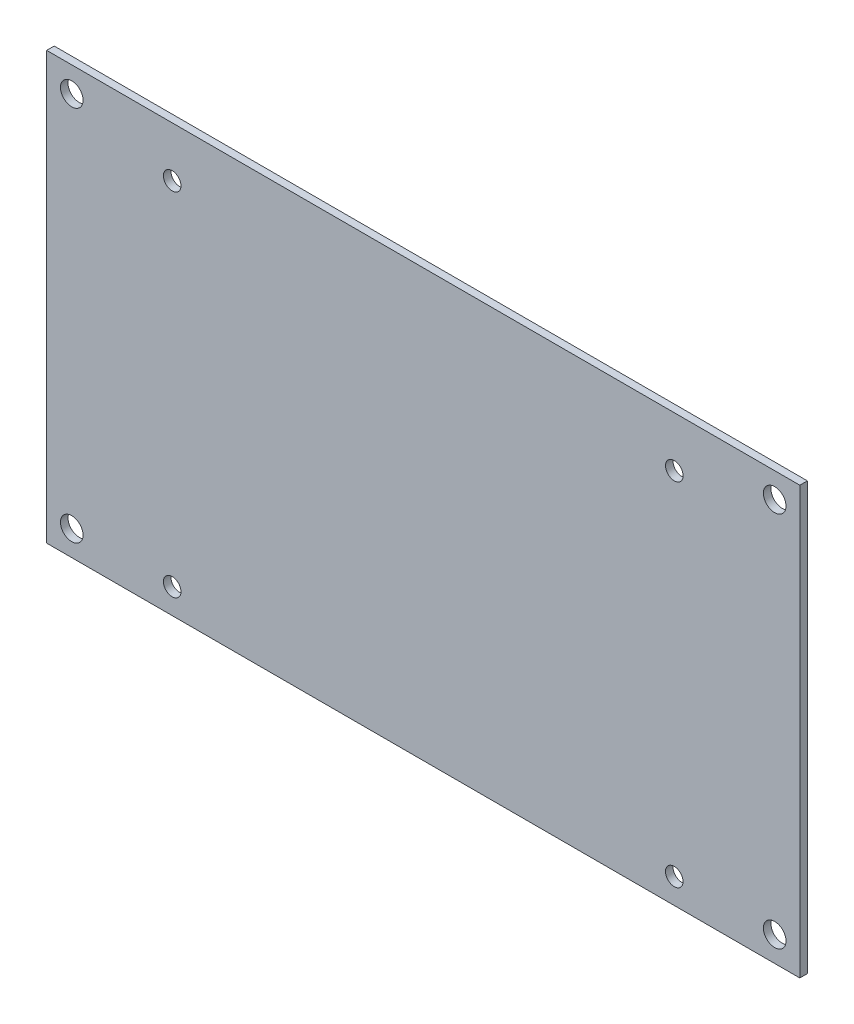
ISO-10303-21;
HEADER;
FILE_DESCRIPTION(('STEP AP214'),'2;1');
FILE_NAME('part.step','',(''),(''),'','','');
FILE_SCHEMA(('AUTOMOTIVE_DESIGN { 1 0 10303 214 1 1 1 1 }'));
ENDSEC;
DATA;
#1=APPLICATION_CONTEXT('core data for automotive mechanical design processes');
#2=APPLICATION_PROTOCOL_DEFINITION('international standard','automotive_design',2000,#1);
#3=PRODUCT_CONTEXT('',#1,'mechanical');
#4=PRODUCT('Part','Part','',(#3));
#5=PRODUCT_RELATED_PRODUCT_CATEGORY('part','',(#4));
#6=PRODUCT_DEFINITION_FORMATION('','',#4);
#7=PRODUCT_DEFINITION_CONTEXT('part definition',#1,'design');
#8=PRODUCT_DEFINITION('design','',#6,#7);
#9=PRODUCT_DEFINITION_SHAPE('','',#8);
#10=(LENGTH_UNIT() NAMED_UNIT(*) SI_UNIT(.MILLI.,.METRE.));
#11=(NAMED_UNIT(*) PLANE_ANGLE_UNIT() SI_UNIT($,.RADIAN.));
#12=(NAMED_UNIT(*) SI_UNIT($,.STERADIAN.) SOLID_ANGLE_UNIT());
#13=UNCERTAINTY_MEASURE_WITH_UNIT(LENGTH_MEASURE(1.E-05),#10,'distance_accuracy_value','');
#14=(GEOMETRIC_REPRESENTATION_CONTEXT(3) GLOBAL_UNCERTAINTY_ASSIGNED_CONTEXT((#13)) GLOBAL_UNIT_ASSIGNED_CONTEXT((#10,
#11,#12)) REPRESENTATION_CONTEXT('',''));
#15=CARTESIAN_POINT('',(0.,0.,0.));
#16=DIRECTION('',(0.,0.,1.));
#17=DIRECTION('',(1.,0.,0.));
#18=AXIS2_PLACEMENT_3D('',#15,#16,#17);
#19=CARTESIAN_POINT('',(-75.,42.5,1.5));
#20=DIRECTION('',(0.,0.,-1.));
#21=DIRECTION('',(-1.,0.,0.));
#22=AXIS2_PLACEMENT_3D('',#19,#20,#21);
#23=PLANE('',#22);
#24=CARTESIAN_POINT('',(50.,32.5,1.5));
#25=DIRECTION('',(0.,0.,1.));
#26=DIRECTION('',(1.,0.,0.));
#27=AXIS2_PLACEMENT_3D('',#24,#25,#26);
#28=CIRCLE('',#27,1.75);
#29=CARTESIAN_POINT('',(51.75,32.5,1.5));
#30=VERTEX_POINT('',#29);
#31=EDGE_CURVE('E143',#30,#30,#28,.T.);
#32=ORIENTED_EDGE('',*,*,#31,.F.);
#33=EDGE_LOOP('',(#32));
#34=FACE_BOUND('',#33,.T.);
#35=CARTESIAN_POINT('',(-50.,32.5,1.5));
#36=DIRECTION('',(0.,0.,1.));
#37=DIRECTION('',(1.,0.,0.));
#38=AXIS2_PLACEMENT_3D('',#35,#36,#37);
#39=CIRCLE('',#38,1.75);
#40=CARTESIAN_POINT('',(-48.25,32.5,1.5));
#41=VERTEX_POINT('',#40);
#42=EDGE_CURVE('E131',#41,#41,#39,.T.);
#43=ORIENTED_EDGE('',*,*,#42,.F.);
#44=EDGE_LOOP('',(#43));
#45=FACE_BOUND('',#44,.T.);
#46=CARTESIAN_POINT('',(70.,-37.5,1.5));
#47=DIRECTION('',(0.,0.,1.));
#48=DIRECTION('',(1.,0.,0.));
#49=AXIS2_PLACEMENT_3D('',#46,#47,#48);
#50=CIRCLE('',#49,2.25);
#51=CARTESIAN_POINT('',(72.25,-37.5,1.5));
#52=VERTEX_POINT('',#51);
#53=EDGE_CURVE('E119',#52,#52,#50,.T.);
#54=ORIENTED_EDGE('',*,*,#53,.F.);
#55=EDGE_LOOP('',(#54));
#56=FACE_BOUND('',#55,.T.);
#57=CARTESIAN_POINT('',(-70.,37.5,1.5));
#58=DIRECTION('',(0.,0.,1.));
#59=DIRECTION('',(1.,0.,0.));
#60=AXIS2_PLACEMENT_3D('',#57,#58,#59);
#61=CIRCLE('',#60,2.25);
#62=CARTESIAN_POINT('',(-67.75,37.5,1.5));
#63=VERTEX_POINT('',#62);
#64=EDGE_CURVE('E98',#63,#63,#61,.T.);
#65=ORIENTED_EDGE('',*,*,#64,.F.);
#66=EDGE_LOOP('',(#65));
#67=FACE_BOUND('',#66,.T.);
#68=DIRECTION('',(0.,-1.,0.));
#69=VECTOR('',#68,1.);
#70=CARTESIAN_POINT('',(-75.,-42.5,1.5));
#71=LINE('',#70,#69);
#72=CARTESIAN_POINT('',(-75.,42.5,1.5));
#73=VERTEX_POINT('',#72);
#74=CARTESIAN_POINT('',(-75.,-42.5,1.5));
#75=VERTEX_POINT('',#74);
#76=EDGE_CURVE('E83',#73,#75,#71,.T.);
#77=ORIENTED_EDGE('',*,*,#76,.T.);
#78=DIRECTION('',(1.,0.,0.));
#79=VECTOR('',#78,1.);
#80=CARTESIAN_POINT('',(-75.,-42.5,1.5));
#81=LINE('',#80,#79);
#82=CARTESIAN_POINT('',(75.,-42.5,1.5));
#83=VERTEX_POINT('',#82);
#84=EDGE_CURVE('E78',#75,#83,#81,.T.);
#85=ORIENTED_EDGE('',*,*,#84,.T.);
#86=DIRECTION('',(0.,1.,0.));
#87=VECTOR('',#86,1.);
#88=CARTESIAN_POINT('',(75.,-42.5,1.5));
#89=LINE('',#88,#87);
#90=CARTESIAN_POINT('',(75.,42.5,1.5));
#91=VERTEX_POINT('',#90);
#92=EDGE_CURVE('E81',#83,#91,#89,.T.);
#93=ORIENTED_EDGE('',*,*,#92,.T.);
#94=DIRECTION('',(-1.,0.,0.));
#95=VECTOR('',#94,1.);
#96=CARTESIAN_POINT('',(-75.,42.5,1.5));
#97=LINE('',#96,#95);
#98=EDGE_CURVE('E48',#91,#73,#97,.T.);
#99=ORIENTED_EDGE('',*,*,#98,.T.);
#100=EDGE_LOOP('',(#77,#85,#93,#99));
#101=FACE_BOUND('',#100,.T.);
#102=CARTESIAN_POINT('',(-70.,-37.5,1.5));
#103=DIRECTION('',(0.,0.,1.));
#104=DIRECTION('',(-1.,0.,0.));
#105=AXIS2_PLACEMENT_3D('',#102,#103,#104);
#106=CIRCLE('',#105,2.25);
#107=CARTESIAN_POINT('',(-72.25,-37.5,1.5));
#108=VERTEX_POINT('',#107);
#109=EDGE_CURVE('E113',#108,#108,#106,.T.);
#110=ORIENTED_EDGE('',*,*,#109,.F.);
#111=EDGE_LOOP('',(#110));
#112=FACE_BOUND('',#111,.T.);
#113=CARTESIAN_POINT('',(70.,37.5,1.5));
#114=DIRECTION('',(0.,0.,1.));
#115=DIRECTION('',(-1.,0.,0.));
#116=AXIS2_PLACEMENT_3D('',#113,#114,#115);
#117=CIRCLE('',#116,2.25);
#118=CARTESIAN_POINT('',(67.75,37.5,1.5));
#119=VERTEX_POINT('',#118);
#120=EDGE_CURVE('E125',#119,#119,#117,.T.);
#121=ORIENTED_EDGE('',*,*,#120,.F.);
#122=EDGE_LOOP('',(#121));
#123=FACE_BOUND('',#122,.T.);
#124=CARTESIAN_POINT('',(-50.,-37.5,1.5));
#125=DIRECTION('',(0.,0.,1.));
#126=DIRECTION('',(-1.,0.,0.));
#127=AXIS2_PLACEMENT_3D('',#124,#125,#126);
#128=CIRCLE('',#127,1.75);
#129=CARTESIAN_POINT('',(-51.75,-37.5,1.5));
#130=VERTEX_POINT('',#129);
#131=EDGE_CURVE('E137',#130,#130,#128,.T.);
#132=ORIENTED_EDGE('',*,*,#131,.F.);
#133=EDGE_LOOP('',(#132));
#134=FACE_BOUND('',#133,.T.);
#135=CARTESIAN_POINT('',(50.,-37.5,1.5));
#136=DIRECTION('',(0.,0.,1.));
#137=DIRECTION('',(-1.,0.,0.));
#138=AXIS2_PLACEMENT_3D('',#135,#136,#137);
#139=CIRCLE('',#138,1.75);
#140=CARTESIAN_POINT('',(48.25,-37.5,1.5));
#141=VERTEX_POINT('',#140);
#142=EDGE_CURVE('E149',#141,#141,#139,.T.);
#143=ORIENTED_EDGE('',*,*,#142,.F.);
#144=EDGE_LOOP('',(#143));
#145=FACE_BOUND('',#144,.T.);
#146=ADVANCED_FACE('F31',(#34,#45,#56,#67,#101,#112,#123,#134,#145),#23,.F.);
#147=CARTESIAN_POINT('',(-75.,42.5,0.));
#148=DIRECTION('',(0.,0.,-1.));
#149=DIRECTION('',(-1.,0.,0.));
#150=AXIS2_PLACEMENT_3D('',#147,#148,#149);
#151=PLANE('',#150);
#152=CARTESIAN_POINT('',(50.,32.5,0.));
#153=DIRECTION('',(0.,0.,1.));
#154=DIRECTION('',(1.,0.,0.));
#155=AXIS2_PLACEMENT_3D('',#152,#153,#154);
#156=CIRCLE('',#155,1.75);
#157=CARTESIAN_POINT('',(51.75,32.5,0.));
#158=VERTEX_POINT('',#157);
#159=EDGE_CURVE('E146',#158,#158,#156,.T.);
#160=ORIENTED_EDGE('',*,*,#159,.T.);
#161=EDGE_LOOP('',(#160));
#162=FACE_BOUND('',#161,.T.);
#163=CARTESIAN_POINT('',(-50.,32.5,0.));
#164=DIRECTION('',(0.,0.,1.));
#165=DIRECTION('',(1.,0.,0.));
#166=AXIS2_PLACEMENT_3D('',#163,#164,#165);
#167=CIRCLE('',#166,1.75);
#168=CARTESIAN_POINT('',(-48.25,32.5,0.));
#169=VERTEX_POINT('',#168);
#170=EDGE_CURVE('E134',#169,#169,#167,.T.);
#171=ORIENTED_EDGE('',*,*,#170,.T.);
#172=EDGE_LOOP('',(#171));
#173=FACE_BOUND('',#172,.T.);
#174=CARTESIAN_POINT('',(70.,-37.5,0.));
#175=DIRECTION('',(0.,0.,1.));
#176=DIRECTION('',(1.,0.,0.));
#177=AXIS2_PLACEMENT_3D('',#174,#175,#176);
#178=CIRCLE('',#177,2.25);
#179=CARTESIAN_POINT('',(72.25,-37.5,0.));
#180=VERTEX_POINT('',#179);
#181=EDGE_CURVE('E122',#180,#180,#178,.T.);
#182=ORIENTED_EDGE('',*,*,#181,.T.);
#183=EDGE_LOOP('',(#182));
#184=FACE_BOUND('',#183,.T.);
#185=CARTESIAN_POINT('',(-70.,37.5,0.));
#186=DIRECTION('',(0.,0.,1.));
#187=DIRECTION('',(1.,0.,0.));
#188=AXIS2_PLACEMENT_3D('',#185,#186,#187);
#189=CIRCLE('',#188,2.25);
#190=CARTESIAN_POINT('',(-67.75,37.5,0.));
#191=VERTEX_POINT('',#190);
#192=EDGE_CURVE('E110',#191,#191,#189,.T.);
#193=ORIENTED_EDGE('',*,*,#192,.T.);
#194=EDGE_LOOP('',(#193));
#195=FACE_BOUND('',#194,.T.);
#196=DIRECTION('',(0.,-1.,0.));
#197=VECTOR('',#196,1.);
#198=CARTESIAN_POINT('',(-75.,-42.5,0.));
#199=LINE('',#198,#197);
#200=CARTESIAN_POINT('',(-75.,42.5,0.));
#201=VERTEX_POINT('',#200);
#202=CARTESIAN_POINT('',(-75.,-42.5,0.));
#203=VERTEX_POINT('',#202);
#204=EDGE_CURVE('E95',#201,#203,#199,.T.);
#205=ORIENTED_EDGE('',*,*,#204,.F.);
#206=DIRECTION('',(-1.,0.,0.));
#207=VECTOR('',#206,1.);
#208=CARTESIAN_POINT('',(-75.,42.5,0.));
#209=LINE('',#208,#207);
#210=CARTESIAN_POINT('',(75.,42.5,0.));
#211=VERTEX_POINT('',#210);
#212=EDGE_CURVE('E71',#211,#201,#209,.T.);
#213=ORIENTED_EDGE('',*,*,#212,.F.);
#214=DIRECTION('',(0.,1.,0.));
#215=VECTOR('',#214,1.);
#216=CARTESIAN_POINT('',(75.,-42.5,0.));
#217=LINE('',#216,#215);
#218=CARTESIAN_POINT('',(75.,-42.5,0.));
#219=VERTEX_POINT('',#218);
#220=EDGE_CURVE('E65',#219,#211,#217,.T.);
#221=ORIENTED_EDGE('',*,*,#220,.F.);
#222=DIRECTION('',(1.,0.,0.));
#223=VECTOR('',#222,1.);
#224=CARTESIAN_POINT('',(-75.,-42.5,0.));
#225=LINE('',#224,#223);
#226=EDGE_CURVE('E87',#203,#219,#225,.T.);
#227=ORIENTED_EDGE('',*,*,#226,.F.);
#228=EDGE_LOOP('',(#205,#213,#221,#227));
#229=FACE_BOUND('',#228,.T.);
#230=CARTESIAN_POINT('',(-70.,-37.5,0.));
#231=DIRECTION('',(0.,0.,1.));
#232=DIRECTION('',(-1.,0.,0.));
#233=AXIS2_PLACEMENT_3D('',#230,#231,#232);
#234=CIRCLE('',#233,2.25);
#235=CARTESIAN_POINT('',(-72.25,-37.5,0.));
#236=VERTEX_POINT('',#235);
#237=EDGE_CURVE('E116',#236,#236,#234,.T.);
#238=ORIENTED_EDGE('',*,*,#237,.T.);
#239=EDGE_LOOP('',(#238));
#240=FACE_BOUND('',#239,.T.);
#241=CARTESIAN_POINT('',(70.,37.5,0.));
#242=DIRECTION('',(0.,0.,1.));
#243=DIRECTION('',(-1.,0.,0.));
#244=AXIS2_PLACEMENT_3D('',#241,#242,#243);
#245=CIRCLE('',#244,2.25);
#246=CARTESIAN_POINT('',(67.75,37.5,0.));
#247=VERTEX_POINT('',#246);
#248=EDGE_CURVE('E128',#247,#247,#245,.T.);
#249=ORIENTED_EDGE('',*,*,#248,.T.);
#250=EDGE_LOOP('',(#249));
#251=FACE_BOUND('',#250,.T.);
#252=CARTESIAN_POINT('',(-50.,-37.5,0.));
#253=DIRECTION('',(0.,0.,1.));
#254=DIRECTION('',(-1.,0.,0.));
#255=AXIS2_PLACEMENT_3D('',#252,#253,#254);
#256=CIRCLE('',#255,1.75);
#257=CARTESIAN_POINT('',(-51.75,-37.5,0.));
#258=VERTEX_POINT('',#257);
#259=EDGE_CURVE('E140',#258,#258,#256,.T.);
#260=ORIENTED_EDGE('',*,*,#259,.T.);
#261=EDGE_LOOP('',(#260));
#262=FACE_BOUND('',#261,.T.);
#263=CARTESIAN_POINT('',(50.,-37.5,0.));
#264=DIRECTION('',(0.,0.,1.));
#265=DIRECTION('',(-1.,0.,0.));
#266=AXIS2_PLACEMENT_3D('',#263,#264,#265);
#267=CIRCLE('',#266,1.75);
#268=CARTESIAN_POINT('',(48.25,-37.5,0.));
#269=VERTEX_POINT('',#268);
#270=EDGE_CURVE('E152',#269,#269,#267,.T.);
#271=ORIENTED_EDGE('',*,*,#270,.T.);
#272=EDGE_LOOP('',(#271));
#273=FACE_BOUND('',#272,.T.);
#274=ADVANCED_FACE('F106',(#162,#173,#184,#195,#229,#240,#251,#262,#273),#151,.T.);
#275=CARTESIAN_POINT('',(-75.,-42.5,1.5));
#276=DIRECTION('',(1.,0.,0.));
#277=DIRECTION('',(0.,0.,-1.));
#278=AXIS2_PLACEMENT_3D('',#275,#276,#277);
#279=PLANE('',#278);
#280=ORIENTED_EDGE('',*,*,#204,.T.);
#281=DIRECTION('',(0.,0.,-1.));
#282=VECTOR('',#281,1.);
#283=CARTESIAN_POINT('',(-75.,-42.5,1.5));
#284=LINE('',#283,#282);
#285=EDGE_CURVE('E11',#75,#203,#284,.T.);
#286=ORIENTED_EDGE('',*,*,#285,.F.);
#287=ORIENTED_EDGE('',*,*,#76,.F.);
#288=DIRECTION('',(0.,0.,-1.));
#289=VECTOR('',#288,1.);
#290=CARTESIAN_POINT('',(-75.,42.5,1.5));
#291=LINE('',#290,#289);
#292=EDGE_CURVE('E91',#73,#201,#291,.T.);
#293=ORIENTED_EDGE('',*,*,#292,.T.);
#294=EDGE_LOOP('',(#280,#286,#287,#293));
#295=FACE_BOUND('',#294,.T.);
#296=ADVANCED_FACE('F33',(#295),#279,.F.);
#297=CARTESIAN_POINT('',(-75.,-42.5,1.5));
#298=DIRECTION('',(0.,1.,0.));
#299=DIRECTION('',(-1.,0.,0.));
#300=AXIS2_PLACEMENT_3D('',#297,#298,#299);
#301=PLANE('',#300);
#302=ORIENTED_EDGE('',*,*,#226,.T.);
#303=DIRECTION('',(0.,0.,-1.));
#304=VECTOR('',#303,1.);
#305=CARTESIAN_POINT('',(75.,-42.5,1.5));
#306=LINE('',#305,#304);
#307=EDGE_CURVE('E40',#83,#219,#306,.T.);
#308=ORIENTED_EDGE('',*,*,#307,.F.);
#309=ORIENTED_EDGE('',*,*,#84,.F.);
#310=ORIENTED_EDGE('',*,*,#285,.T.);
#311=EDGE_LOOP('',(#302,#308,#309,#310));
#312=FACE_BOUND('',#311,.T.);
#313=ADVANCED_FACE('F86',(#312),#301,.F.);
#314=CARTESIAN_POINT('',(75.,-42.5,1.5));
#315=DIRECTION('',(-1.,0.,0.));
#316=DIRECTION('',(0.,-1.,0.));
#317=AXIS2_PLACEMENT_3D('',#314,#315,#316);
#318=PLANE('',#317);
#319=ORIENTED_EDGE('',*,*,#220,.T.);
#320=DIRECTION('',(0.,0.,-1.));
#321=VECTOR('',#320,1.);
#322=CARTESIAN_POINT('',(75.,42.5,1.5));
#323=LINE('',#322,#321);
#324=EDGE_CURVE('E88',#91,#211,#323,.T.);
#325=ORIENTED_EDGE('',*,*,#324,.F.);
#326=ORIENTED_EDGE('',*,*,#92,.F.);
#327=ORIENTED_EDGE('',*,*,#307,.T.);
#328=EDGE_LOOP('',(#319,#325,#326,#327));
#329=FACE_BOUND('',#328,.T.);
#330=ADVANCED_FACE('F89',(#329),#318,.F.);
#331=CARTESIAN_POINT('',(-75.,42.5,1.5));
#332=DIRECTION('',(0.,-1.,0.));
#333=DIRECTION('',(1.,0.,0.));
#334=AXIS2_PLACEMENT_3D('',#331,#332,#333);
#335=PLANE('',#334);
#336=ORIENTED_EDGE('',*,*,#212,.T.);
#337=ORIENTED_EDGE('',*,*,#292,.F.);
#338=ORIENTED_EDGE('',*,*,#98,.F.);
#339=ORIENTED_EDGE('',*,*,#324,.T.);
#340=EDGE_LOOP('',(#336,#337,#338,#339));
#341=FACE_BOUND('',#340,.T.);
#342=ADVANCED_FACE('F103',(#341),#335,.F.);
#343=CARTESIAN_POINT('',(-70.,37.5,1.5));
#344=DIRECTION('',(0.,0.,-1.));
#345=DIRECTION('',(-1.,0.,0.));
#346=AXIS2_PLACEMENT_3D('',#343,#344,#345);
#347=CYLINDRICAL_SURFACE('',#346,2.25);
#348=ORIENTED_EDGE('',*,*,#64,.T.);
#349=EDGE_LOOP('',(#348));
#350=FACE_BOUND('',#349,.T.);
#351=ORIENTED_EDGE('',*,*,#192,.F.);
#352=EDGE_LOOP('',(#351));
#353=FACE_BOUND('',#352,.T.);
#354=ADVANCED_FACE('F172',(#350,#353),#347,.F.);
#355=CARTESIAN_POINT('',(-70.,-37.5,1.5));
#356=DIRECTION('',(0.,0.,-1.));
#357=DIRECTION('',(-1.,0.,0.));
#358=AXIS2_PLACEMENT_3D('',#355,#356,#357);
#359=CYLINDRICAL_SURFACE('',#358,2.25);
#360=ORIENTED_EDGE('',*,*,#109,.T.);
#361=EDGE_LOOP('',(#360));
#362=FACE_BOUND('',#361,.T.);
#363=ORIENTED_EDGE('',*,*,#237,.F.);
#364=EDGE_LOOP('',(#363));
#365=FACE_BOUND('',#364,.T.);
#366=ADVANCED_FACE('F218',(#362,#365),#359,.F.);
#367=CARTESIAN_POINT('',(70.,-37.5,1.5));
#368=DIRECTION('',(0.,0.,-1.));
#369=DIRECTION('',(-1.,0.,0.));
#370=AXIS2_PLACEMENT_3D('',#367,#368,#369);
#371=CYLINDRICAL_SURFACE('',#370,2.25);
#372=ORIENTED_EDGE('',*,*,#53,.T.);
#373=EDGE_LOOP('',(#372));
#374=FACE_BOUND('',#373,.T.);
#375=ORIENTED_EDGE('',*,*,#181,.F.);
#376=EDGE_LOOP('',(#375));
#377=FACE_BOUND('',#376,.T.);
#378=ADVANCED_FACE('F226',(#374,#377),#371,.F.);
#379=CARTESIAN_POINT('',(70.,37.5,1.5));
#380=DIRECTION('',(0.,0.,-1.));
#381=DIRECTION('',(-1.,0.,0.));
#382=AXIS2_PLACEMENT_3D('',#379,#380,#381);
#383=CYLINDRICAL_SURFACE('',#382,2.25);
#384=ORIENTED_EDGE('',*,*,#120,.T.);
#385=EDGE_LOOP('',(#384));
#386=FACE_BOUND('',#385,.T.);
#387=ORIENTED_EDGE('',*,*,#248,.F.);
#388=EDGE_LOOP('',(#387));
#389=FACE_BOUND('',#388,.T.);
#390=ADVANCED_FACE('F234',(#386,#389),#383,.F.);
#391=CARTESIAN_POINT('',(-50.,32.5,1.5));
#392=DIRECTION('',(0.,0.,-1.));
#393=DIRECTION('',(-1.,0.,0.));
#394=AXIS2_PLACEMENT_3D('',#391,#392,#393);
#395=CYLINDRICAL_SURFACE('',#394,1.75);
#396=ORIENTED_EDGE('',*,*,#42,.T.);
#397=EDGE_LOOP('',(#396));
#398=FACE_BOUND('',#397,.T.);
#399=ORIENTED_EDGE('',*,*,#170,.F.);
#400=EDGE_LOOP('',(#399));
#401=FACE_BOUND('',#400,.T.);
#402=ADVANCED_FACE('F243',(#398,#401),#395,.F.);
#403=CARTESIAN_POINT('',(-50.,-37.5,1.5));
#404=DIRECTION('',(0.,0.,-1.));
#405=DIRECTION('',(-1.,0.,0.));
#406=AXIS2_PLACEMENT_3D('',#403,#404,#405);
#407=CYLINDRICAL_SURFACE('',#406,1.75);
#408=ORIENTED_EDGE('',*,*,#131,.T.);
#409=EDGE_LOOP('',(#408));
#410=FACE_BOUND('',#409,.T.);
#411=ORIENTED_EDGE('',*,*,#259,.F.);
#412=EDGE_LOOP('',(#411));
#413=FACE_BOUND('',#412,.T.);
#414=ADVANCED_FACE('F252',(#410,#413),#407,.F.);
#415=CARTESIAN_POINT('',(50.,32.5,1.5));
#416=DIRECTION('',(0.,0.,-1.));
#417=DIRECTION('',(-1.,0.,0.));
#418=AXIS2_PLACEMENT_3D('',#415,#416,#417);
#419=CYLINDRICAL_SURFACE('',#418,1.75);
#420=ORIENTED_EDGE('',*,*,#31,.T.);
#421=EDGE_LOOP('',(#420));
#422=FACE_BOUND('',#421,.T.);
#423=ORIENTED_EDGE('',*,*,#159,.F.);
#424=EDGE_LOOP('',(#423));
#425=FACE_BOUND('',#424,.T.);
#426=ADVANCED_FACE('F261',(#422,#425),#419,.F.);
#427=CARTESIAN_POINT('',(50.,-37.5,1.5));
#428=DIRECTION('',(0.,0.,-1.));
#429=DIRECTION('',(-1.,0.,0.));
#430=AXIS2_PLACEMENT_3D('',#427,#428,#429);
#431=CYLINDRICAL_SURFACE('',#430,1.75);
#432=ORIENTED_EDGE('',*,*,#142,.T.);
#433=EDGE_LOOP('',(#432));
#434=FACE_BOUND('',#433,.T.);
#435=ORIENTED_EDGE('',*,*,#270,.F.);
#436=EDGE_LOOP('',(#435));
#437=FACE_BOUND('',#436,.T.);
#438=ADVANCED_FACE('F158',(#434,#437),#431,.F.);
#439=CLOSED_SHELL('',(#146,#274,#296,#313,#330,#342,#354,#366,#378,#390,#402,#414,#426,#438));
#440=MANIFOLD_SOLID_BREP('B2',#439);
#441=ADVANCED_BREP_SHAPE_REPRESENTATION('',(#18,#440),#14);
#442=SHAPE_DEFINITION_REPRESENTATION(#9,#441);
ENDSEC;
END-ISO-10303-21;
